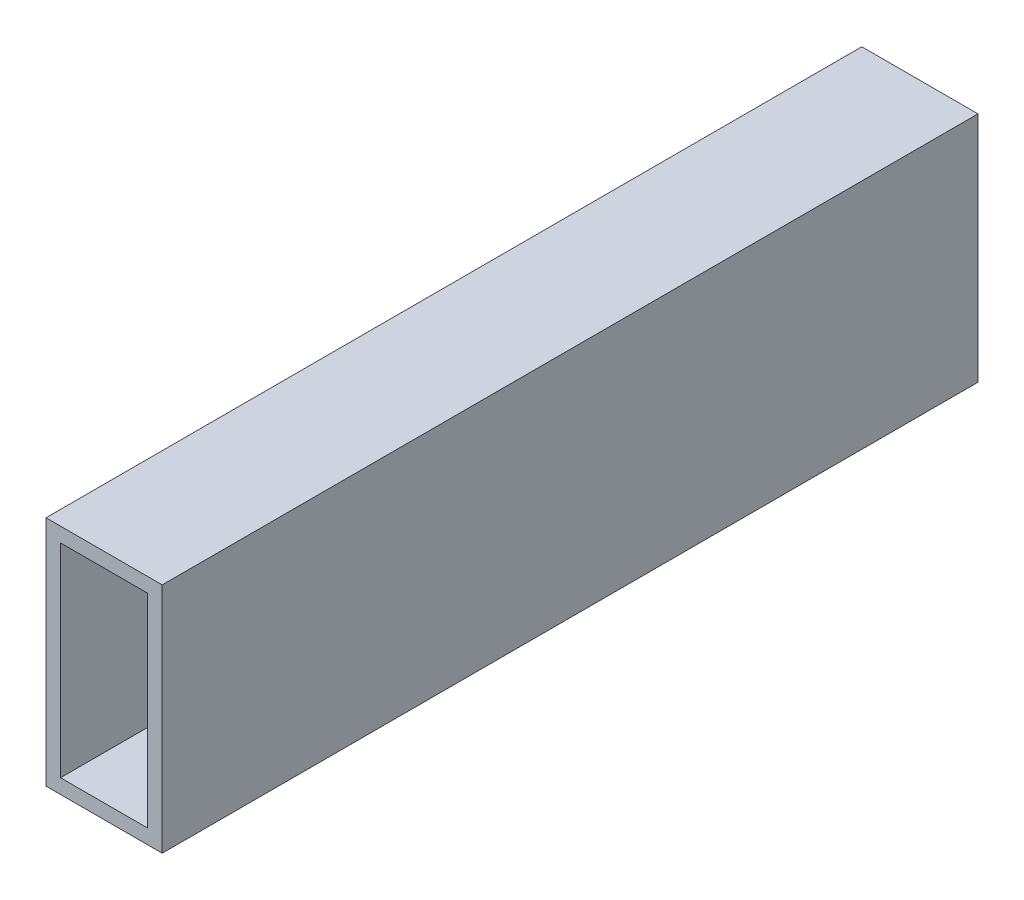
ISO-10303-21;
HEADER;
FILE_DESCRIPTION(('STEP AP214'),'2;1');
FILE_NAME('part.step','',(''),(''),'','','');
FILE_SCHEMA(('AUTOMOTIVE_DESIGN { 1 0 10303 214 1 1 1 1 }'));
ENDSEC;
DATA;
#1=APPLICATION_CONTEXT('core data for automotive mechanical design processes');
#2=APPLICATION_PROTOCOL_DEFINITION('international standard','automotive_design',2000,#1);
#3=PRODUCT_CONTEXT('',#1,'mechanical');
#4=PRODUCT('Part','Part','',(#3));
#5=PRODUCT_RELATED_PRODUCT_CATEGORY('part','',(#4));
#6=PRODUCT_DEFINITION_FORMATION('','',#4);
#7=PRODUCT_DEFINITION_CONTEXT('part definition',#1,'design');
#8=PRODUCT_DEFINITION('design','',#6,#7);
#9=PRODUCT_DEFINITION_SHAPE('','',#8);
#10=(LENGTH_UNIT() NAMED_UNIT(*) SI_UNIT(.MILLI.,.METRE.));
#11=(NAMED_UNIT(*) PLANE_ANGLE_UNIT() SI_UNIT($,.RADIAN.));
#12=(NAMED_UNIT(*) SI_UNIT($,.STERADIAN.) SOLID_ANGLE_UNIT());
#13=UNCERTAINTY_MEASURE_WITH_UNIT(LENGTH_MEASURE(1.E-05),#10,'distance_accuracy_value','');
#14=(GEOMETRIC_REPRESENTATION_CONTEXT(3) GLOBAL_UNCERTAINTY_ASSIGNED_CONTEXT((#13)) GLOBAL_UNIT_ASSIGNED_CONTEXT((#10,
#11,#12)) REPRESENTATION_CONTEXT('',''));
#15=CARTESIAN_POINT('',(0.,0.,0.));
#16=DIRECTION('',(0.,0.,1.));
#17=DIRECTION('',(1.,0.,0.));
#18=AXIS2_PLACEMENT_3D('',#15,#16,#17);
#19=CARTESIAN_POINT('',(0.,0.,89.154));
#20=DIRECTION('',(0.,0.,-1.));
#21=DIRECTION('',(-1.,0.,0.));
#22=AXIS2_PLACEMENT_3D('',#19,#20,#21);
#23=PLANE('',#22);
#24=DIRECTION('',(0.,1.,0.));
#25=VECTOR('',#24,1.);
#26=CARTESIAN_POINT('',(12.7,-25.4,89.154));
#27=LINE('',#26,#25);
#28=CARTESIAN_POINT('',(12.7,-25.4,89.154));
#29=VERTEX_POINT('',#28);
#30=CARTESIAN_POINT('',(12.7,25.4,89.154));
#31=VERTEX_POINT('',#30);
#32=EDGE_CURVE('E135',#29,#31,#27,.T.);
#33=ORIENTED_EDGE('',*,*,#32,.T.);
#34=DIRECTION('',(-1.,0.,0.));
#35=VECTOR('',#34,1.);
#36=CARTESIAN_POINT('',(-12.7,25.4,89.154));
#37=LINE('',#36,#35);
#38=CARTESIAN_POINT('',(-12.7,25.4,89.154));
#39=VERTEX_POINT('',#38);
#40=EDGE_CURVE('E138',#31,#39,#37,.T.);
#41=ORIENTED_EDGE('',*,*,#40,.T.);
#42=DIRECTION('',(0.,-1.,0.));
#43=VECTOR('',#42,1.);
#44=CARTESIAN_POINT('',(-12.7,-25.4,89.154));
#45=LINE('',#44,#43);
#46=CARTESIAN_POINT('',(-12.7,-25.4,89.154));
#47=VERTEX_POINT('',#46);
#48=EDGE_CURVE('E141',#39,#47,#45,.T.);
#49=ORIENTED_EDGE('',*,*,#48,.T.);
#50=DIRECTION('',(1.,0.,0.));
#51=VECTOR('',#50,1.);
#52=CARTESIAN_POINT('',(-12.7,-25.4,89.154));
#53=LINE('',#52,#51);
#54=EDGE_CURVE('E143',#47,#29,#53,.T.);
#55=ORIENTED_EDGE('',*,*,#54,.T.);
#56=EDGE_LOOP('',(#33,#41,#49,#55));
#57=FACE_BOUND('',#56,.T.);
#58=DIRECTION('',(0.,1.,0.));
#59=VECTOR('',#58,1.);
#60=CARTESIAN_POINT('',(9.52500000000001,-22.225,89.154));
#61=LINE('',#60,#59);
#62=CARTESIAN_POINT('',(9.52500000000001,-22.225,89.154));
#63=VERTEX_POINT('',#62);
#64=CARTESIAN_POINT('',(9.52500000000001,22.225,89.154));
#65=VERTEX_POINT('',#64);
#66=EDGE_CURVE('E99',#63,#65,#61,.T.);
#67=ORIENTED_EDGE('',*,*,#66,.F.);
#68=DIRECTION('',(1.,0.,0.));
#69=VECTOR('',#68,1.);
#70=CARTESIAN_POINT('',(-9.525,-22.225,89.154));
#71=LINE('',#70,#69);
#72=CARTESIAN_POINT('',(-9.525,-22.225,89.154));
#73=VERTEX_POINT('',#72);
#74=EDGE_CURVE('E121',#73,#63,#71,.T.);
#75=ORIENTED_EDGE('',*,*,#74,.F.);
#76=DIRECTION('',(0.,-1.,0.));
#77=VECTOR('',#76,1.);
#78=CARTESIAN_POINT('',(-9.525,-22.225,89.154));
#79=LINE('',#78,#77);
#80=CARTESIAN_POINT('',(-9.52500000000001,22.225,89.154));
#81=VERTEX_POINT('',#80);
#82=EDGE_CURVE('E119',#81,#73,#79,.T.);
#83=ORIENTED_EDGE('',*,*,#82,.F.);
#84=DIRECTION('',(-1.,0.,0.));
#85=VECTOR('',#84,1.);
#86=CARTESIAN_POINT('',(-9.52500000000001,22.225,89.154));
#87=LINE('',#86,#85);
#88=EDGE_CURVE('E107',#65,#81,#87,.T.);
#89=ORIENTED_EDGE('',*,*,#88,.F.);
#90=EDGE_LOOP('',(#67,#75,#83,#89));
#91=FACE_BOUND('',#90,.T.);
#92=ADVANCED_FACE('F34',(#57,#91),#23,.F.);
#93=CARTESIAN_POINT('',(0.,0.,-89.154));
#94=DIRECTION('',(0.,0.,-1.));
#95=DIRECTION('',(-1.,0.,0.));
#96=AXIS2_PLACEMENT_3D('',#93,#94,#95);
#97=PLANE('',#96);
#98=DIRECTION('',(0.,1.,0.));
#99=VECTOR('',#98,1.);
#100=CARTESIAN_POINT('',(12.7,-25.4,-89.154));
#101=LINE('',#100,#99);
#102=CARTESIAN_POINT('',(12.7,-25.4,-89.154));
#103=VERTEX_POINT('',#102);
#104=CARTESIAN_POINT('',(12.7,25.4,-89.154));
#105=VERTEX_POINT('',#104);
#106=EDGE_CURVE('E115',#103,#105,#101,.T.);
#107=ORIENTED_EDGE('',*,*,#106,.F.);
#108=DIRECTION('',(1.,0.,0.));
#109=VECTOR('',#108,1.);
#110=CARTESIAN_POINT('',(-12.7,-25.4,-89.154));
#111=LINE('',#110,#109);
#112=CARTESIAN_POINT('',(-12.7,-25.4,-89.154));
#113=VERTEX_POINT('',#112);
#114=EDGE_CURVE('E139',#113,#103,#111,.T.);
#115=ORIENTED_EDGE('',*,*,#114,.F.);
#116=DIRECTION('',(0.,-1.,0.));
#117=VECTOR('',#116,1.);
#118=CARTESIAN_POINT('',(-12.7,-25.4,-89.154));
#119=LINE('',#118,#117);
#120=CARTESIAN_POINT('',(-12.7,25.4,-89.154));
#121=VERTEX_POINT('',#120);
#122=EDGE_CURVE('E150',#121,#113,#119,.T.);
#123=ORIENTED_EDGE('',*,*,#122,.F.);
#124=DIRECTION('',(-1.,0.,0.));
#125=VECTOR('',#124,1.);
#126=CARTESIAN_POINT('',(-12.7,25.4,-89.154));
#127=LINE('',#126,#125);
#128=EDGE_CURVE('E148',#105,#121,#127,.T.);
#129=ORIENTED_EDGE('',*,*,#128,.F.);
#130=EDGE_LOOP('',(#107,#115,#123,#129));
#131=FACE_BOUND('',#130,.T.);
#132=DIRECTION('',(1.,0.,0.));
#133=VECTOR('',#132,1.);
#134=CARTESIAN_POINT('',(-9.525,-22.225,-89.154));
#135=LINE('',#134,#133);
#136=CARTESIAN_POINT('',(-9.525,-22.225,-89.154));
#137=VERTEX_POINT('',#136);
#138=CARTESIAN_POINT('',(9.52500000000001,-22.225,-89.154));
#139=VERTEX_POINT('',#138);
#140=EDGE_CURVE('E108',#137,#139,#135,.T.);
#141=ORIENTED_EDGE('',*,*,#140,.T.);
#142=DIRECTION('',(0.,1.,0.));
#143=VECTOR('',#142,1.);
#144=CARTESIAN_POINT('',(9.52500000000001,-22.225,-89.154));
#145=LINE('',#144,#143);
#146=CARTESIAN_POINT('',(9.52500000000001,22.225,-89.154));
#147=VERTEX_POINT('',#146);
#148=EDGE_CURVE('E57',#139,#147,#145,.T.);
#149=ORIENTED_EDGE('',*,*,#148,.T.);
#150=DIRECTION('',(-1.,0.,0.));
#151=VECTOR('',#150,1.);
#152=CARTESIAN_POINT('',(-9.52500000000001,22.225,-89.154));
#153=LINE('',#152,#151);
#154=CARTESIAN_POINT('',(-9.52500000000001,22.225,-89.154));
#155=VERTEX_POINT('',#154);
#156=EDGE_CURVE('E114',#147,#155,#153,.T.);
#157=ORIENTED_EDGE('',*,*,#156,.T.);
#158=DIRECTION('',(0.,-1.,0.));
#159=VECTOR('',#158,1.);
#160=CARTESIAN_POINT('',(-9.525,-22.225,-89.154));
#161=LINE('',#160,#159);
#162=EDGE_CURVE('E127',#155,#137,#161,.T.);
#163=ORIENTED_EDGE('',*,*,#162,.T.);
#164=EDGE_LOOP('',(#141,#149,#157,#163));
#165=FACE_BOUND('',#164,.T.);
#166=ADVANCED_FACE('F168',(#131,#165),#97,.T.);
#167=CARTESIAN_POINT('',(12.7,-25.4,89.154));
#168=DIRECTION('',(-1.,0.,0.));
#169=DIRECTION('',(0.,0.,1.));
#170=AXIS2_PLACEMENT_3D('',#167,#168,#169);
#171=PLANE('',#170);
#172=ORIENTED_EDGE('',*,*,#106,.T.);
#173=DIRECTION('',(0.,0.,-1.));
#174=VECTOR('',#173,1.);
#175=CARTESIAN_POINT('',(12.7,25.4,89.154));
#176=LINE('',#175,#174);
#177=EDGE_CURVE('E11',#31,#105,#176,.T.);
#178=ORIENTED_EDGE('',*,*,#177,.F.);
#179=ORIENTED_EDGE('',*,*,#32,.F.);
#180=DIRECTION('',(0.,0.,-1.));
#181=VECTOR('',#180,1.);
#182=CARTESIAN_POINT('',(12.7,-25.4,89.154));
#183=LINE('',#182,#181);
#184=EDGE_CURVE('E145',#29,#103,#183,.T.);
#185=ORIENTED_EDGE('',*,*,#184,.T.);
#186=EDGE_LOOP('',(#172,#178,#179,#185));
#187=FACE_BOUND('',#186,.T.);
#188=ADVANCED_FACE('F36',(#187),#171,.F.);
#189=CARTESIAN_POINT('',(-12.7,25.4,89.154));
#190=DIRECTION('',(0.,-1.,0.));
#191=DIRECTION('',(0.,0.,-1.));
#192=AXIS2_PLACEMENT_3D('',#189,#190,#191);
#193=PLANE('',#192);
#194=ORIENTED_EDGE('',*,*,#128,.T.);
#195=DIRECTION('',(0.,0.,-1.));
#196=VECTOR('',#195,1.);
#197=CARTESIAN_POINT('',(-12.7,25.4,89.154));
#198=LINE('',#197,#196);
#199=EDGE_CURVE('E42',#39,#121,#198,.T.);
#200=ORIENTED_EDGE('',*,*,#199,.F.);
#201=ORIENTED_EDGE('',*,*,#40,.F.);
#202=ORIENTED_EDGE('',*,*,#177,.T.);
#203=EDGE_LOOP('',(#194,#200,#201,#202));
#204=FACE_BOUND('',#203,.T.);
#205=ADVANCED_FACE('F178',(#204),#193,.F.);
#206=CARTESIAN_POINT('',(-12.7,-25.4,89.154));
#207=DIRECTION('',(1.,0.,0.));
#208=DIRECTION('',(0.,0.,-1.));
#209=AXIS2_PLACEMENT_3D('',#206,#207,#208);
#210=PLANE('',#209);
#211=ORIENTED_EDGE('',*,*,#122,.T.);
#212=DIRECTION('',(0.,0.,-1.));
#213=VECTOR('',#212,1.);
#214=CARTESIAN_POINT('',(-12.7,-25.4,89.154));
#215=LINE('',#214,#213);
#216=EDGE_CURVE('E155',#47,#113,#215,.T.);
#217=ORIENTED_EDGE('',*,*,#216,.F.);
#218=ORIENTED_EDGE('',*,*,#48,.F.);
#219=ORIENTED_EDGE('',*,*,#199,.T.);
#220=EDGE_LOOP('',(#211,#217,#218,#219));
#221=FACE_BOUND('',#220,.T.);
#222=ADVANCED_FACE('F162',(#221),#210,.F.);
#223=CARTESIAN_POINT('',(-12.7,-25.4,89.154));
#224=DIRECTION('',(0.,1.,0.));
#225=DIRECTION('',(0.,0.,1.));
#226=AXIS2_PLACEMENT_3D('',#223,#224,#225);
#227=PLANE('',#226);
#228=ORIENTED_EDGE('',*,*,#114,.T.);
#229=ORIENTED_EDGE('',*,*,#184,.F.);
#230=ORIENTED_EDGE('',*,*,#54,.F.);
#231=ORIENTED_EDGE('',*,*,#216,.T.);
#232=EDGE_LOOP('',(#228,#229,#230,#231));
#233=FACE_BOUND('',#232,.T.);
#234=ADVANCED_FACE('F172',(#233),#227,.F.);
#235=CARTESIAN_POINT('',(9.52500000000001,-22.225,89.154));
#236=DIRECTION('',(-1.,0.,0.));
#237=DIRECTION('',(0.,0.,1.));
#238=AXIS2_PLACEMENT_3D('',#235,#236,#237);
#239=PLANE('',#238);
#240=ORIENTED_EDGE('',*,*,#148,.F.);
#241=DIRECTION('',(0.,0.,-1.));
#242=VECTOR('',#241,1.);
#243=CARTESIAN_POINT('',(9.52500000000001,-22.225,89.154));
#244=LINE('',#243,#242);
#245=EDGE_CURVE('E103',#63,#139,#244,.T.);
#246=ORIENTED_EDGE('',*,*,#245,.F.);
#247=ORIENTED_EDGE('',*,*,#66,.T.);
#248=DIRECTION('',(0.,0.,-1.));
#249=VECTOR('',#248,1.);
#250=CARTESIAN_POINT('',(9.52500000000001,22.225,89.154));
#251=LINE('',#250,#249);
#252=EDGE_CURVE('E102',#65,#147,#251,.T.);
#253=ORIENTED_EDGE('',*,*,#252,.T.);
#254=EDGE_LOOP('',(#240,#246,#247,#253));
#255=FACE_BOUND('',#254,.T.);
#256=ADVANCED_FACE('F101',(#255),#239,.T.);
#257=CARTESIAN_POINT('',(-9.52500000000001,22.225,89.154));
#258=DIRECTION('',(0.,-1.,0.));
#259=DIRECTION('',(1.,0.,0.));
#260=AXIS2_PLACEMENT_3D('',#257,#258,#259);
#261=PLANE('',#260);
#262=ORIENTED_EDGE('',*,*,#156,.F.);
#263=ORIENTED_EDGE('',*,*,#252,.F.);
#264=ORIENTED_EDGE('',*,*,#88,.T.);
#265=DIRECTION('',(0.,0.,-1.));
#266=VECTOR('',#265,1.);
#267=CARTESIAN_POINT('',(-9.52500000000001,22.225,89.154));
#268=LINE('',#267,#266);
#269=EDGE_CURVE('E116',#81,#155,#268,.T.);
#270=ORIENTED_EDGE('',*,*,#269,.T.);
#271=EDGE_LOOP('',(#262,#263,#264,#270));
#272=FACE_BOUND('',#271,.T.);
#273=ADVANCED_FACE('F111',(#272),#261,.T.);
#274=CARTESIAN_POINT('',(-9.525,-22.225,89.154));
#275=DIRECTION('',(1.,0.,0.));
#276=DIRECTION('',(0.,1.,0.));
#277=AXIS2_PLACEMENT_3D('',#274,#275,#276);
#278=PLANE('',#277);
#279=ORIENTED_EDGE('',*,*,#162,.F.);
#280=ORIENTED_EDGE('',*,*,#269,.F.);
#281=ORIENTED_EDGE('',*,*,#82,.T.);
#282=DIRECTION('',(0.,0.,-1.));
#283=VECTOR('',#282,1.);
#284=CARTESIAN_POINT('',(-9.525,-22.225,89.154));
#285=LINE('',#284,#283);
#286=EDGE_CURVE('E49',#73,#137,#285,.T.);
#287=ORIENTED_EDGE('',*,*,#286,.T.);
#288=EDGE_LOOP('',(#279,#280,#281,#287));
#289=FACE_BOUND('',#288,.T.);
#290=ADVANCED_FACE('F201',(#289),#278,.T.);
#291=CARTESIAN_POINT('',(-9.525,-22.225,89.154));
#292=DIRECTION('',(0.,1.,0.));
#293=DIRECTION('',(-1.,0.,0.));
#294=AXIS2_PLACEMENT_3D('',#291,#292,#293);
#295=PLANE('',#294);
#296=ORIENTED_EDGE('',*,*,#140,.F.);
#297=ORIENTED_EDGE('',*,*,#286,.F.);
#298=ORIENTED_EDGE('',*,*,#74,.T.);
#299=ORIENTED_EDGE('',*,*,#245,.T.);
#300=EDGE_LOOP('',(#296,#297,#298,#299));
#301=FACE_BOUND('',#300,.T.);
#302=ADVANCED_FACE('F205',(#301),#295,.T.);
#303=CLOSED_SHELL('',(#92,#166,#188,#205,#222,#234,#256,#273,#290,#302));
#304=MANIFOLD_SOLID_BREP('B2',#303);
#305=ADVANCED_BREP_SHAPE_REPRESENTATION('',(#18,#304),#14);
#306=SHAPE_DEFINITION_REPRESENTATION(#9,#305);
ENDSEC;
END-ISO-10303-21;
